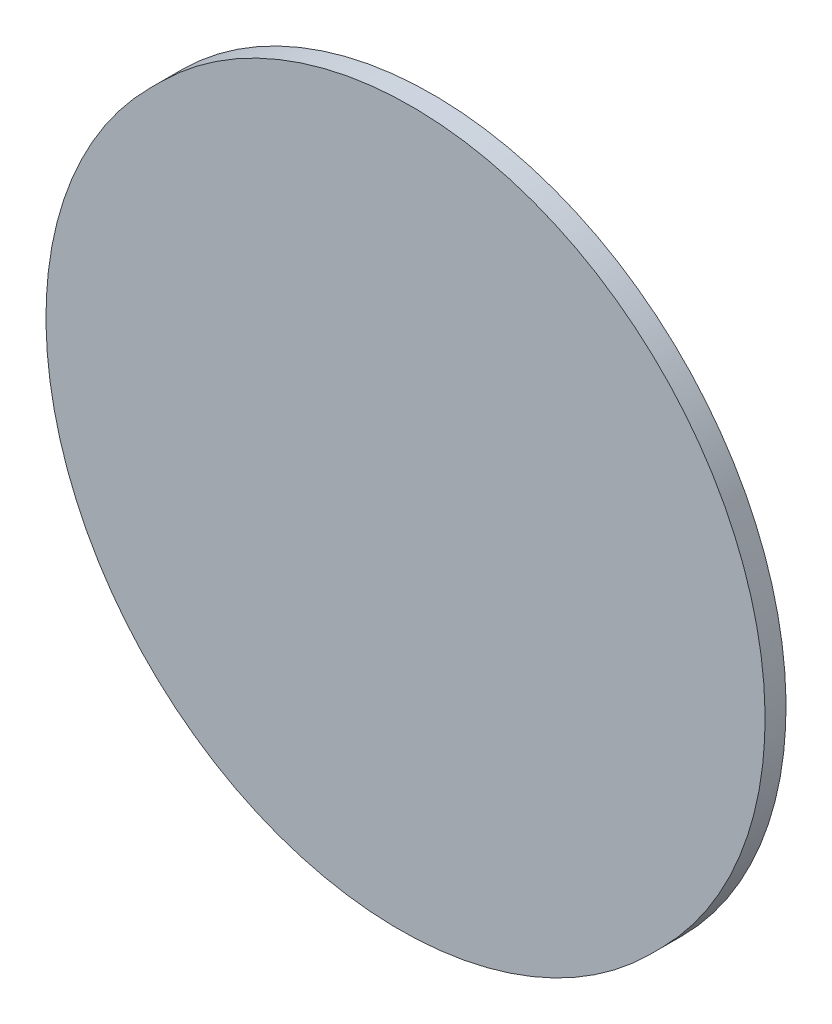
ISO-10303-21;
HEADER;
FILE_DESCRIPTION(('STEP AP214'),'2;1');
FILE_NAME('part.step','',(''),(''),'','','');
FILE_SCHEMA(('AUTOMOTIVE_DESIGN { 1 0 10303 214 1 1 1 1 }'));
ENDSEC;
DATA;
#1=APPLICATION_CONTEXT('core data for automotive mechanical design processes');
#2=APPLICATION_PROTOCOL_DEFINITION('international standard','automotive_design',2000,#1);
#3=PRODUCT_CONTEXT('',#1,'mechanical');
#4=PRODUCT('Part','Part','',(#3));
#5=PRODUCT_RELATED_PRODUCT_CATEGORY('part','',(#4));
#6=PRODUCT_DEFINITION_FORMATION('','',#4);
#7=PRODUCT_DEFINITION_CONTEXT('part definition',#1,'design');
#8=PRODUCT_DEFINITION('design','',#6,#7);
#9=PRODUCT_DEFINITION_SHAPE('','',#8);
#10=(LENGTH_UNIT() NAMED_UNIT(*) SI_UNIT(.MILLI.,.METRE.));
#11=(NAMED_UNIT(*) PLANE_ANGLE_UNIT() SI_UNIT($,.RADIAN.));
#12=(NAMED_UNIT(*) SI_UNIT($,.STERADIAN.) SOLID_ANGLE_UNIT());
#13=UNCERTAINTY_MEASURE_WITH_UNIT(LENGTH_MEASURE(1.E-05),#10,'distance_accuracy_value','');
#14=(GEOMETRIC_REPRESENTATION_CONTEXT(3) GLOBAL_UNCERTAINTY_ASSIGNED_CONTEXT((#13)) GLOBAL_UNIT_ASSIGNED_CONTEXT((#10,
#11,#12)) REPRESENTATION_CONTEXT('',''));
#15=CARTESIAN_POINT('',(0.,0.,0.));
#16=DIRECTION('',(0.,0.,1.));
#17=DIRECTION('',(1.,0.,0.));
#18=AXIS2_PLACEMENT_3D('',#15,#16,#17);
#19=CARTESIAN_POINT('',(55.30426582,76.46153618,0.));
#20=DIRECTION('',(-0.707106781186673,0.707106781186422,0.));
#21=DIRECTION('',(0.707106781186422,0.707106781186673,0.));
#22=AXIS2_PLACEMENT_3D('',#19,#20,#21);
#23=PLANE('',#22);
#24=DIRECTION('',(0.707106781186422,0.707106781186673,0.));
#25=VECTOR('',#24,1.);
#26=CARTESIAN_POINT('',(55.30426582,76.46153618,0.03556));
#27=LINE('',#26,#25);
#28=CARTESIAN_POINT('',(55.30426582,76.46153618,0.03556));
#29=VERTEX_POINT('',#28);
#30=CARTESIAN_POINT('',(55.32428102,76.48155138,0.03556));
#31=VERTEX_POINT('',#30);
#32=EDGE_CURVE('E11',#29,#31,#27,.T.);
#33=ORIENTED_EDGE('',*,*,#32,.F.);
#34=DIRECTION('',(0.,0.,1.));
#35=VECTOR('',#34,1.);
#36=CARTESIAN_POINT('',(55.30426582,76.46153618,0.));
#37=LINE('',#36,#35);
#38=CARTESIAN_POINT('',(55.30426582,76.46153618,0.));
#39=VERTEX_POINT('',#38);
#40=EDGE_CURVE('E24',#39,#29,#37,.T.);
#41=ORIENTED_EDGE('',*,*,#40,.F.);
#42=DIRECTION('',(0.707106781186422,0.707106781186673,0.));
#43=VECTOR('',#42,1.);
#44=CARTESIAN_POINT('',(55.30426582,76.46153618,0.));
#45=LINE('',#44,#43);
#46=CARTESIAN_POINT('',(55.32428102,76.48155138,0.));
#47=VERTEX_POINT('',#46);
#48=EDGE_CURVE('E75',#39,#47,#45,.T.);
#49=ORIENTED_EDGE('',*,*,#48,.T.);
#50=DIRECTION('',(0.,0.,1.));
#51=VECTOR('',#50,1.);
#52=CARTESIAN_POINT('',(55.32428102,76.48155138,0.));
#53=LINE('',#52,#51);
#54=EDGE_CURVE('E37',#47,#31,#53,.T.);
#55=ORIENTED_EDGE('',*,*,#54,.T.);
#56=EDGE_LOOP('',(#33,#41,#49,#55));
#57=FACE_BOUND('',#56,.T.);
#58=ADVANCED_FACE('F17',(#57),#23,.F.);
#59=CARTESIAN_POINT('',(54.9000172,76.9058152,0.));
#60=DIRECTION('',(0.,0.,-1.));
#61=DIRECTION('',(0.707106781186542,-0.707106781186554,0.));
#62=AXIS2_PLACEMENT_3D('',#59,#60,#61);
#63=CYLINDRICAL_SURFACE('',#62,0.599999648268215);
#64=CARTESIAN_POINT('',(54.9000172,76.9058152,0.03556));
#65=DIRECTION('',(0.,0.,1.));
#66=DIRECTION('',(0.707106781186542,-0.707106781186554,0.));
#67=AXIS2_PLACEMENT_3D('',#64,#65,#66);
#68=CIRCLE('',#67,0.599999648268215);
#69=CARTESIAN_POINT('',(54.47575338,77.33007902,0.03556));
#70=VERTEX_POINT('',#69);
#71=EDGE_CURVE('E83',#31,#70,#68,.T.);
#72=ORIENTED_EDGE('',*,*,#71,.F.);
#73=ORIENTED_EDGE('',*,*,#54,.F.);
#74=CARTESIAN_POINT('',(54.9000172,76.9058152,0.));
#75=DIRECTION('',(0.,0.,1.));
#76=DIRECTION('',(0.707106781186542,-0.707106781186554,0.));
#77=AXIS2_PLACEMENT_3D('',#74,#75,#76);
#78=CIRCLE('',#77,0.599999648268215);
#79=CARTESIAN_POINT('',(54.47575338,77.33007902,0.));
#80=VERTEX_POINT('',#79);
#81=EDGE_CURVE('E81',#47,#80,#78,.T.);
#82=ORIENTED_EDGE('',*,*,#81,.T.);
#83=DIRECTION('',(0.,0.,1.));
#84=VECTOR('',#83,1.);
#85=CARTESIAN_POINT('',(54.47575338,77.33007902,0.));
#86=LINE('',#85,#84);
#87=EDGE_CURVE('E67',#80,#70,#86,.T.);
#88=ORIENTED_EDGE('',*,*,#87,.T.);
#89=EDGE_LOOP('',(#72,#73,#82,#88));
#90=FACE_BOUND('',#89,.T.);
#91=ADVANCED_FACE('F89',(#90),#63,.T.);
#92=CARTESIAN_POINT('',(54.47575338,77.33007902,0.));
#93=DIRECTION('',(0.707106781186548,-0.707106781186548,0.));
#94=DIRECTION('',(-0.707106781186548,-0.707106781186548,0.));
#95=AXIS2_PLACEMENT_3D('',#92,#93,#94);
#96=PLANE('',#95);
#97=DIRECTION('',(-0.707106781186548,-0.707106781186548,0.));
#98=VECTOR('',#97,1.);
#99=CARTESIAN_POINT('',(54.47575338,77.33007902,0.03556));
#100=LINE('',#99,#98);
#101=CARTESIAN_POINT('',(54.45573818,77.31006382,0.03556));
#102=VERTEX_POINT('',#101);
#103=EDGE_CURVE('E71',#70,#102,#100,.T.);
#104=ORIENTED_EDGE('',*,*,#103,.F.);
#105=ORIENTED_EDGE('',*,*,#87,.F.);
#106=DIRECTION('',(-0.707106781186548,-0.707106781186548,0.));
#107=VECTOR('',#106,1.);
#108=CARTESIAN_POINT('',(54.47575338,77.33007902,0.));
#109=LINE('',#108,#107);
#110=CARTESIAN_POINT('',(54.45573818,77.31006382,0.));
#111=VERTEX_POINT('',#110);
#112=EDGE_CURVE('E63',#80,#111,#109,.T.);
#113=ORIENTED_EDGE('',*,*,#112,.T.);
#114=DIRECTION('',(0.,0.,1.));
#115=VECTOR('',#114,1.);
#116=CARTESIAN_POINT('',(54.45573818,77.31006382,0.));
#117=LINE('',#116,#115);
#118=EDGE_CURVE('E53',#111,#102,#117,.T.);
#119=ORIENTED_EDGE('',*,*,#118,.T.);
#120=EDGE_LOOP('',(#104,#105,#113,#119));
#121=FACE_BOUND('',#120,.T.);
#122=ADVANCED_FACE('F66',(#121),#96,.F.);
#123=CARTESIAN_POINT('',(54.880002,76.8858,0.));
#124=DIRECTION('',(0.,0.,-1.));
#125=DIRECTION('',(-0.707106781186542,0.707106781186554,0.));
#126=AXIS2_PLACEMENT_3D('',#123,#124,#125);
#127=CYLINDRICAL_SURFACE('',#126,0.599999648268216);
#128=CARTESIAN_POINT('',(54.880002,76.8858,0.03556));
#129=DIRECTION('',(0.,0.,1.));
#130=DIRECTION('',(-0.707106781186542,0.707106781186554,0.));
#131=AXIS2_PLACEMENT_3D('',#128,#129,#130);
#132=CIRCLE('',#131,0.599999648268216);
#133=EDGE_CURVE('E59',#102,#29,#132,.T.);
#134=ORIENTED_EDGE('',*,*,#133,.F.);
#135=ORIENTED_EDGE('',*,*,#118,.F.);
#136=CARTESIAN_POINT('',(54.880002,76.8858,0.));
#137=DIRECTION('',(0.,0.,1.));
#138=DIRECTION('',(-0.707106781186542,0.707106781186554,0.));
#139=AXIS2_PLACEMENT_3D('',#136,#137,#138);
#140=CIRCLE('',#139,0.599999648268216);
#141=EDGE_CURVE('E57',#111,#39,#140,.T.);
#142=ORIENTED_EDGE('',*,*,#141,.T.);
#143=ORIENTED_EDGE('',*,*,#40,.T.);
#144=EDGE_LOOP('',(#134,#135,#142,#143));
#145=FACE_BOUND('',#144,.T.);
#146=ADVANCED_FACE('F55',(#145),#127,.T.);
#147=CARTESIAN_POINT('',(55.30426582,76.46153618,0.));
#148=DIRECTION('',(0.,0.,-1.));
#149=DIRECTION('',(-1.,0.,0.));
#150=AXIS2_PLACEMENT_3D('',#147,#148,#149);
#151=PLANE('',#150);
#152=ORIENTED_EDGE('',*,*,#141,.F.);
#153=ORIENTED_EDGE('',*,*,#112,.F.);
#154=ORIENTED_EDGE('',*,*,#81,.F.);
#155=ORIENTED_EDGE('',*,*,#48,.F.);
#156=EDGE_LOOP('',(#152,#153,#154,#155));
#157=FACE_BOUND('',#156,.T.);
#158=ADVANCED_FACE('F74',(#157),#151,.T.);
#159=CARTESIAN_POINT('',(55.30426582,76.46153618,0.03556));
#160=DIRECTION('',(0.,0.,-1.));
#161=DIRECTION('',(-1.,0.,0.));
#162=AXIS2_PLACEMENT_3D('',#159,#160,#161);
#163=PLANE('',#162);
#164=ORIENTED_EDGE('',*,*,#32,.T.);
#165=ORIENTED_EDGE('',*,*,#71,.T.);
#166=ORIENTED_EDGE('',*,*,#103,.T.);
#167=ORIENTED_EDGE('',*,*,#133,.T.);
#168=EDGE_LOOP('',(#164,#165,#166,#167));
#169=FACE_BOUND('',#168,.T.);
#170=ADVANCED_FACE('F91',(#169),#163,.F.);
#171=CLOSED_SHELL('',(#58,#91,#122,#146,#158,#170));
#172=MANIFOLD_SOLID_BREP('B1',#171);
#173=ADVANCED_BREP_SHAPE_REPRESENTATION('',(#18,#172),#14);
#174=SHAPE_DEFINITION_REPRESENTATION(#9,#173);
ENDSEC;
END-ISO-10303-21;
